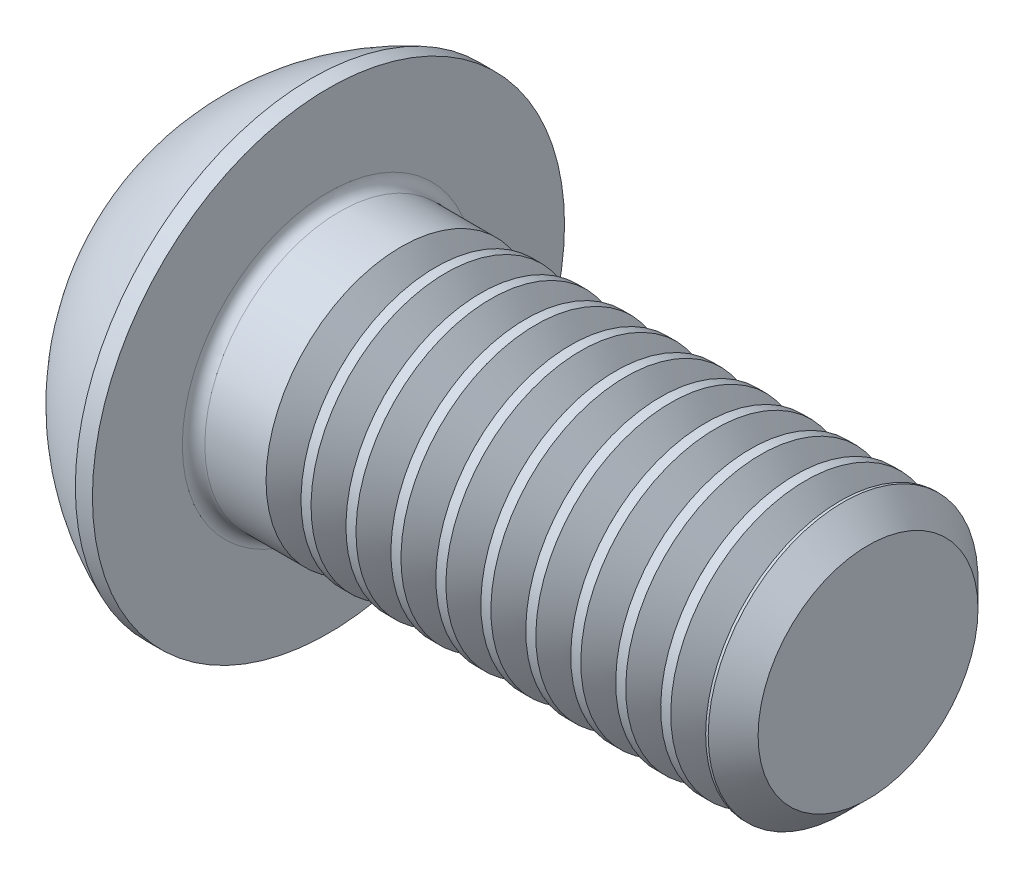
ISO-10303-21;
HEADER;
FILE_DESCRIPTION(('STEP AP214'),'2;1');
FILE_NAME('part.step','',(''),(''),'','','');
FILE_SCHEMA(('AUTOMOTIVE_DESIGN { 1 0 10303 214 1 1 1 1 }'));
ENDSEC;
DATA;
#1=APPLICATION_CONTEXT('core data for automotive mechanical design processes');
#2=APPLICATION_PROTOCOL_DEFINITION('international standard','automotive_design',2000,#1);
#3=PRODUCT_CONTEXT('',#1,'mechanical');
#4=PRODUCT('Part','Part','',(#3));
#5=PRODUCT_RELATED_PRODUCT_CATEGORY('part','',(#4));
#6=PRODUCT_DEFINITION_FORMATION('','',#4);
#7=PRODUCT_DEFINITION_CONTEXT('part definition',#1,'design');
#8=PRODUCT_DEFINITION('design','',#6,#7);
#9=PRODUCT_DEFINITION_SHAPE('','',#8);
#10=(LENGTH_UNIT() NAMED_UNIT(*) SI_UNIT(.MILLI.,.METRE.));
#11=(NAMED_UNIT(*) PLANE_ANGLE_UNIT() SI_UNIT($,.RADIAN.));
#12=(NAMED_UNIT(*) SI_UNIT($,.STERADIAN.) SOLID_ANGLE_UNIT());
#13=UNCERTAINTY_MEASURE_WITH_UNIT(LENGTH_MEASURE(1.E-05),#10,'distance_accuracy_value','');
#14=(GEOMETRIC_REPRESENTATION_CONTEXT(3) GLOBAL_UNCERTAINTY_ASSIGNED_CONTEXT((#13)) GLOBAL_UNIT_ASSIGNED_CONTEXT((#10,
#11,#12)) REPRESENTATION_CONTEXT('',''));
#15=CARTESIAN_POINT('',(0.,0.,0.));
#16=DIRECTION('',(0.,0.,1.));
#17=DIRECTION('',(1.,0.,0.));
#18=AXIS2_PLACEMENT_3D('',#15,#16,#17);
#19=CARTESIAN_POINT('',(0.,0.,0.));
#20=DIRECTION('',(-1.,0.,0.));
#21=DIRECTION('',(0.,0.,1.));
#22=AXIS2_PLACEMENT_3D('',#19,#20,#21);
#23=PLANE('',#22);
#24=CARTESIAN_POINT('',(0.,0.,0.));
#25=DIRECTION('',(-1.,0.,0.));
#26=DIRECTION('',(0.,0.,1.));
#27=AXIS2_PLACEMENT_3D('',#24,#25,#26);
#28=CIRCLE('',#27,2.625);
#29=CARTESIAN_POINT('',(0.,2.625,0.));
#30=VERTEX_POINT('',#29);
#31=EDGE_CURVE('E156',#30,#30,#28,.T.);
#32=ORIENTED_EDGE('',*,*,#31,.T.);
#33=EDGE_LOOP('',(#32));
#34=FACE_BOUND('',#33,.T.);
#35=DIRECTION('',(0.,-1.,0.));
#36=VECTOR('',#35,1.);
#37=CARTESIAN_POINT('',(0.,-1.15470053837925,2.));
#38=LINE('',#37,#36);
#39=CARTESIAN_POINT('',(0.,1.15470053837925,2.));
#40=VERTEX_POINT('',#39);
#41=CARTESIAN_POINT('',(0.,-1.15470053837925,2.));
#42=VERTEX_POINT('',#41);
#43=EDGE_CURVE('E51',#40,#42,#38,.T.);
#44=ORIENTED_EDGE('',*,*,#43,.T.);
#45=DIRECTION('',(0.,-0.499999999999998,-0.86602540378444));
#46=VECTOR('',#45,1.);
#47=CARTESIAN_POINT('',(0.,-2.3094010767585,0.));
#48=LINE('',#47,#46);
#49=CARTESIAN_POINT('',(0.,-2.3094010767585,0.));
#50=VERTEX_POINT('',#49);
#51=EDGE_CURVE('E409',#42,#50,#48,.T.);
#52=ORIENTED_EDGE('',*,*,#51,.T.);
#53=DIRECTION('',(0.,0.499999999999998,-0.86602540378444));
#54=VECTOR('',#53,1.);
#55=CARTESIAN_POINT('',(0.,-1.15470053837925,-2.));
#56=LINE('',#55,#54);
#57=CARTESIAN_POINT('',(0.,-1.15470053837925,-2.));
#58=VERTEX_POINT('',#57);
#59=EDGE_CURVE('E131',#50,#58,#56,.T.);
#60=ORIENTED_EDGE('',*,*,#59,.T.);
#61=DIRECTION('',(0.,1.,0.));
#62=VECTOR('',#61,1.);
#63=CARTESIAN_POINT('',(0.,1.15470053837925,-2.));
#64=LINE('',#63,#62);
#65=CARTESIAN_POINT('',(0.,1.15470053837925,-2.));
#66=VERTEX_POINT('',#65);
#67=EDGE_CURVE('E429',#58,#66,#64,.T.);
#68=ORIENTED_EDGE('',*,*,#67,.T.);
#69=DIRECTION('',(0.,0.499999999999999,0.866025403784439));
#70=VECTOR('',#69,1.);
#71=CARTESIAN_POINT('',(0.,2.3094010767585,0.));
#72=LINE('',#71,#70);
#73=CARTESIAN_POINT('',(0.,2.3094010767585,0.));
#74=VERTEX_POINT('',#73);
#75=EDGE_CURVE('E431',#66,#74,#72,.T.);
#76=ORIENTED_EDGE('',*,*,#75,.T.);
#77=DIRECTION('',(0.,-0.499999999999999,0.866025403784439));
#78=VECTOR('',#77,1.);
#79=CARTESIAN_POINT('',(0.,1.15470053837925,2.));
#80=LINE('',#79,#78);
#81=EDGE_CURVE('E433',#74,#40,#80,.T.);
#82=ORIENTED_EDGE('',*,*,#81,.T.);
#83=EDGE_LOOP('',(#44,#52,#60,#68,#76,#82));
#84=FACE_BOUND('',#83,.T.);
#85=ADVANCED_FACE('F36',(#34,#84),#23,.T.);
#86=CARTESIAN_POINT('',(4.99970462328768,0.,0.));
#87=DIRECTION('',(-1.,0.,0.));
#88=DIRECTION('',(0.,1.,0.));
#89=AXIS2_PLACEMENT_3D('',#86,#87,#88);
#90=SPHERICAL_SURFACE('',#89,5.64691697478582);
#91=CARTESIAN_POINT('',(2.92,0.,0.));
#92=DIRECTION('',(-1.,0.,0.));
#93=DIRECTION('',(0.,0.,1.));
#94=AXIS2_PLACEMENT_3D('',#91,#92,#93);
#95=CIRCLE('',#94,5.25);
#96=CARTESIAN_POINT('',(2.92,5.25,0.));
#97=VERTEX_POINT('',#96);
#98=EDGE_CURVE('E153',#97,#97,#95,.T.);
#99=CARTESIAN_POINT('',(2.92,5.25,0.));
#100=CARTESIAN_POINT('',(2.88116333139993,5.23461555496798,0.));
#101=CARTESIAN_POINT('',(2.84249743445724,5.21880002304115,0.));
#102=CARTESIAN_POINT('',(2.76552608609884,5.18631490596423,0.));
#103=CARTESIAN_POINT('',(2.72722063468312,5.16964532081416,0.));
#104=CARTESIAN_POINT('',(2.65098907959088,5.13546021785716,0.));
#105=CARTESIAN_POINT('',(2.61306297591435,5.11794470005024,0.));
#106=CARTESIAN_POINT('',(2.5376087841269,5.08207638165227,0.));
#107=CARTESIAN_POINT('',(2.50008069601598,5.06372358106121,0.));
#108=CARTESIAN_POINT('',(2.42544101991594,5.02618972911532,0.));
#109=CARTESIAN_POINT('',(2.38832943192683,5.00700867776048,0.));
#110=CARTESIAN_POINT('',(2.31454103209333,4.9678277722965,0.));
#111=CARTESIAN_POINT('',(2.27786422024896,4.94782791818736,0.));
#112=CARTESIAN_POINT('',(2.204963435524,4.90701925630077,0.));
#113=CARTESIAN_POINT('',(2.16873946264343,4.88621044852333,0.));
#114=CARTESIAN_POINT('',(2.09676219540546,4.84379412736126,0.));
#115=CARTESIAN_POINT('',(2.06100890104806,4.82218661397662,0.));
#116=CARTESIAN_POINT('',(1.9899905986814,4.77818352285276,0.));
#117=CARTESIAN_POINT('',(1.95472559067213,4.75578794511354,0.));
#118=CARTESIAN_POINT('',(1.88470122833741,4.71021975468139,0.));
#119=CARTESIAN_POINT('',(1.84994187401195,4.68704714198847,0.));
#120=CARTESIAN_POINT('',(1.78094593736053,4.63993629371345,0.));
#121=CARTESIAN_POINT('',(1.74670935503456,4.61599805813134,0.));
#122=CARTESIAN_POINT('',(1.67877582324134,4.56736775320002,0.));
#123=CARTESIAN_POINT('',(1.6450788737741,4.5426756838508,0.));
#124=CARTESIAN_POINT('',(1.57824120279908,4.4925498717552,0.));
#125=CARTESIAN_POINT('',(1.54510048129131,4.4671161290088,0.));
#126=CARTESIAN_POINT('',(1.4793915874043,4.4155194957489,0.));
#127=CARTESIAN_POINT('',(1.44682341502508,4.38935660523539,0.));
#128=CARTESIAN_POINT('',(1.3822756585948,4.33631456116252,0.));
#129=CARTESIAN_POINT('',(1.35029607454376,4.30943540760316,0.));
#130=CARTESIAN_POINT('',(1.28694124410103,4.2549740749057,0.));
#131=CARTESIAN_POINT('',(1.25556599770935,4.22739189576759,0.));
#132=CARTESIAN_POINT('',(1.19343529429185,4.17153809560631,0.));
#133=CARTESIAN_POINT('',(1.16267983726603,4.14326647458313,0.));
#134=CARTESIAN_POINT('',(1.10180385905236,4.0860477138823,0.));
#135=CARTESIAN_POINT('',(1.07168333786452,4.05710057420464,0.));
#136=CARTESIAN_POINT('',(1.01209206510523,3.99854503210538,0.));
#137=CARTESIAN_POINT('',(0.982621313533779,3.96893662968379,0.));
#138=CARTESIAN_POINT('',(0.924344093786626,3.90907314366641,0.));
#139=CARTESIAN_POINT('',(0.895537625610919,3.87881806007063,0.));
#140=CARTESIAN_POINT('',(0.838603159287822,3.8176761117527,0.));
#141=CARTESIAN_POINT('',(0.810475161140432,3.78678924703054,0.));
#142=CARTESIAN_POINT('',(0.754911487372878,3.72439894764781,0.));
#143=CARTESIAN_POINT('',(0.727475811752715,3.69289551298725,0.));
#144=CARTESIAN_POINT('',(0.673310294583733,3.62928758856413,0.));
#145=CARTESIAN_POINT('',(0.646580453034914,3.59718309880158,0.));
#146=CARTESIAN_POINT('',(0.593839767940169,3.53238887502059,0.));
#147=CARTESIAN_POINT('',(0.567828924394242,3.49969914100215,0.));
#148=CARTESIAN_POINT('',(0.516539045154726,3.43375052777114,0.));
#149=CARTESIAN_POINT('',(0.491260009461136,3.40049164855857,0.));
#150=CARTESIAN_POINT('',(0.441446195334815,3.33342112431611,0.));
#151=CARTESIAN_POINT('',(0.416911416902085,3.29960947928621,0.));
#152=CARTESIAN_POINT('',(0.368598200321405,3.23145007493057,0.));
#153=CARTESIAN_POINT('',(0.344819762173456,3.19710231560483,0.));
#154=CARTESIAN_POINT('',(0.298030936151543,3.12788759851044,0.));
#155=CARTESIAN_POINT('',(0.275020548277578,3.09302064074179,0.));
#156=CARTESIAN_POINT('',(0.229779156601617,3.02278469716988,0.));
#157=CARTESIAN_POINT('',(0.207548152799621,2.98741571136661,0.));
#158=CARTESIAN_POINT('',(0.163876471550351,2.91619313362712,0.));
#159=CARTESIAN_POINT('',(0.142435794103077,2.8803395416909,0.));
#160=CARTESIAN_POINT('',(0.100355347300805,2.80816539636944,0.));
#161=CARTESIAN_POINT('',(0.0797155779458076,2.7718448429842,0.));
#162=CARTESIAN_POINT('',(0.0392470276158926,2.69875470867178,0.));
#163=CARTESIAN_POINT('',(0.0194182466409753,2.66198512774461,0.));
#164=CARTESIAN_POINT('',(0.,2.625,0.));
#165=B_SPLINE_CURVE_WITH_KNOTS('',3,(#99,#100,#101,#102,#103,#104,#105,#106,#107,#108,#109,#110,
#111,#112,#113,#114,#115,#116,#117,#118,#119,#120,#121,#122,#123,#124,#125,#126,#127,#128,#129,
#130,#131,#132,#133,#134,#135,#136,#137,#138,#139,#140,#141,#142,#143,#144,#145,#146,#147,#148,
#149,#150,#151,#152,#153,#154,#155,#156,#157,#158,#159,#160,#161,#162,#163,#164),.UNSPECIFIED.,
.F.,.F.,(4,2,2,2,2,2,2,2,2,2,2,2,2,2,2,2,2,2,2,2,2,2,2,2,2,2,2,2,2,2,2,2,4),(0.,
0.12531586463099,0.25063172926198,0.37594759389297,0.501263458523959,0.626579323154949,
0.751895187785939,0.877211052416928,1.00252691704792,1.12784278167891,1.2531586463099,
1.37847451094089,1.50379037557188,1.62910624020287,1.75442210483386,1.87973796946485,
2.00505383409584,2.13036969872683,2.25568556335782,2.38100142798881,2.5063172926198,
2.63163315725079,2.75694902188178,2.88226488651277,3.00758075114376,3.13289661577475,
3.25821248040574,3.38352834503673,3.50884420966772,3.6341600742987,3.7594759389297,
3.88479180356069,4.01010766819167),.UNSPECIFIED.);
#166=EDGE_CURVE('BSEAM178',#97,#30,#165,.T.);
#167=ORIENTED_EDGE('',*,*,#98,.T.);
#168=ORIENTED_EDGE('',*,*,#31,.F.);
#169=ORIENTED_EDGE('',*,*,#166,.T.);
#170=ORIENTED_EDGE('',*,*,#166,.F.);
#171=EDGE_LOOP('',(#167,#169,#168,#170));
#172=FACE_BOUND('',#171,.T.);
#173=ADVANCED_FACE('F178',(#172),#90,.T.);
#174=CARTESIAN_POINT('',(0.,0.,0.));
#175=DIRECTION('',(-1.,0.,0.));
#176=DIRECTION('',(0.,0.,1.));
#177=AXIS2_PLACEMENT_3D('',#174,#175,#176);
#178=CYLINDRICAL_SURFACE('',#177,5.25);
#179=ORIENTED_EDGE('',*,*,#98,.F.);
#180=EDGE_LOOP('',(#179));
#181=FACE_BOUND('',#180,.T.);
#182=CARTESIAN_POINT('',(3.3,0.,0.));
#183=DIRECTION('',(-1.,0.,0.));
#184=DIRECTION('',(0.,0.,1.));
#185=AXIS2_PLACEMENT_3D('',#182,#183,#184);
#186=CIRCLE('',#185,5.25);
#187=CARTESIAN_POINT('',(3.3,0.,5.25));
#188=VERTEX_POINT('',#187);
#189=EDGE_CURVE('E150',#188,#188,#186,.T.);
#190=ORIENTED_EDGE('',*,*,#189,.T.);
#191=EDGE_LOOP('',(#190));
#192=FACE_BOUND('',#191,.T.);
#193=ADVANCED_FACE('F183',(#181,#192),#178,.T.);
#194=CARTESIAN_POINT('',(3.3,2.99999999999999,0.));
#195=DIRECTION('',(-1.,0.,0.));
#196=DIRECTION('',(0.,0.,1.));
#197=AXIS2_PLACEMENT_3D('',#194,#195,#196);
#198=PLANE('',#197);
#199=CARTESIAN_POINT('',(3.3,0.,0.));
#200=DIRECTION('',(-1.,0.,0.));
#201=DIRECTION('',(0.,0.,1.));
#202=AXIS2_PLACEMENT_3D('',#199,#200,#201);
#203=CIRCLE('',#202,3.24999999999999);
#204=CARTESIAN_POINT('',(3.3,0.,3.24999999999999));
#205=VERTEX_POINT('',#204);
#206=EDGE_CURVE('E44',#205,#205,#203,.T.);
#207=ORIENTED_EDGE('',*,*,#206,.T.);
#208=EDGE_LOOP('',(#207));
#209=FACE_BOUND('',#208,.T.);
#210=ORIENTED_EDGE('',*,*,#189,.F.);
#211=EDGE_LOOP('',(#210));
#212=FACE_BOUND('',#211,.T.);
#213=ADVANCED_FACE('F161',(#209,#212),#198,.F.);
#214=CARTESIAN_POINT('',(0.,0.,0.));
#215=DIRECTION('',(-1.,0.,0.));
#216=DIRECTION('',(0.,0.,1.));
#217=AXIS2_PLACEMENT_3D('',#214,#215,#216);
#218=CYLINDRICAL_SURFACE('',#217,2.99999999999999);
#219=CARTESIAN_POINT('',(4.91173492006271,0.,0.));
#220=DIRECTION('',(-1.,0.,0.));
#221=DIRECTION('',(0.,-1.,0.));
#222=AXIS2_PLACEMENT_3D('',#219,#220,#221);
#223=CIRCLE('',#222,3.);
#224=CARTESIAN_POINT('',(4.91173492006271,-3.,0.));
#225=VERTEX_POINT('',#224);
#226=EDGE_CURVE('E404',#225,#225,#223,.T.);
#227=ORIENTED_EDGE('',*,*,#226,.T.);
#228=EDGE_LOOP('',(#227));
#229=FACE_BOUND('',#228,.T.);
#230=CARTESIAN_POINT('',(3.55,0.,0.));
#231=DIRECTION('',(-1.,0.,0.));
#232=DIRECTION('',(0.,0.,1.));
#233=AXIS2_PLACEMENT_3D('',#230,#231,#232);
#234=CIRCLE('',#233,2.99999999999999);
#235=CARTESIAN_POINT('',(3.55,0.,2.99999999999999));
#236=VERTEX_POINT('',#235);
#237=EDGE_CURVE('E11',#236,#236,#234,.F.);
#238=ORIENTED_EDGE('',*,*,#237,.T.);
#239=EDGE_LOOP('',(#238));
#240=FACE_BOUND('',#239,.T.);
#241=ADVANCED_FACE('F165',(#229,#240),#218,.T.);
#242=CARTESIAN_POINT('',(3.55,0.,0.));
#243=DIRECTION('',(-1.,0.,0.));
#244=DIRECTION('',(0.,0.,1.));
#245=AXIS2_PLACEMENT_3D('',#242,#243,#244);
#246=TOROIDAL_SURFACE('',#245,3.24999999999999,0.25);
#247=ORIENTED_EDGE('',*,*,#237,.F.);
#248=EDGE_LOOP('',(#247));
#249=FACE_BOUND('',#248,.T.);
#250=ORIENTED_EDGE('',*,*,#206,.F.);
#251=EDGE_LOOP('',(#250));
#252=FACE_BOUND('',#251,.T.);
#253=ADVANCED_FACE('F38',(#249,#252),#246,.F.);
#254=CARTESIAN_POINT('',(2.08,-2.3094010767585,0.));
#255=DIRECTION('',(0.,0.86602540378444,-0.499999999999998));
#256=DIRECTION('',(0.,0.499999999999998,0.86602540378444));
#257=AXIS2_PLACEMENT_3D('',#254,#255,#256);
#258=PLANE('',#257);
#259=DIRECTION('',(0.,-0.499999999999998,-0.86602540378444));
#260=VECTOR('',#259,1.);
#261=CARTESIAN_POINT('',(2.08,-2.3094010767585,0.));
#262=LINE('',#261,#260);
#263=CARTESIAN_POINT('',(2.08,-1.15470053837925,2.));
#264=VERTEX_POINT('',#263);
#265=CARTESIAN_POINT('',(2.08,-1.73205080756888,0.999999999999994));
#266=VERTEX_POINT('',#265);
#267=EDGE_CURVE('E117',#264,#266,#262,.T.);
#268=ORIENTED_EDGE('',*,*,#267,.T.);
#269=CARTESIAN_POINT('',(2.08,-2.3094010767585,0.));
#270=VERTEX_POINT('',#269);
#271=EDGE_CURVE('E112',#266,#270,#262,.T.);
#272=ORIENTED_EDGE('',*,*,#271,.T.);
#273=DIRECTION('',(-1.,0.,0.));
#274=VECTOR('',#273,1.);
#275=CARTESIAN_POINT('',(2.08,-2.3094010767585,0.));
#276=LINE('',#275,#274);
#277=EDGE_CURVE('E114',#270,#50,#276,.T.);
#278=ORIENTED_EDGE('',*,*,#277,.T.);
#279=ORIENTED_EDGE('',*,*,#51,.F.);
#280=DIRECTION('',(-1.,0.,0.));
#281=VECTOR('',#280,1.);
#282=CARTESIAN_POINT('',(2.08,-1.15470053837925,2.));
#283=LINE('',#282,#281);
#284=EDGE_CURVE('E426',#264,#42,#283,.T.);
#285=ORIENTED_EDGE('',*,*,#284,.F.);
#286=EDGE_LOOP('',(#268,#272,#278,#279,#285));
#287=FACE_BOUND('',#286,.T.);
#288=ADVANCED_FACE('F113',(#287),#258,.T.);
#289=CARTESIAN_POINT('',(2.08,-1.15470053837925,-2.));
#290=DIRECTION('',(0.,0.86602540378444,0.499999999999998));
#291=DIRECTION('',(0.,-0.499999999999998,0.86602540378444));
#292=AXIS2_PLACEMENT_3D('',#289,#290,#291);
#293=PLANE('',#292);
#294=DIRECTION('',(0.,0.499999999999998,-0.86602540378444));
#295=VECTOR('',#294,1.);
#296=CARTESIAN_POINT('',(2.08,-1.15470053837925,-2.));
#297=LINE('',#296,#295);
#298=CARTESIAN_POINT('',(2.08,-1.73205080756888,-0.999999999999996));
#299=VERTEX_POINT('',#298);
#300=EDGE_CURVE('E59',#270,#299,#297,.T.);
#301=ORIENTED_EDGE('',*,*,#300,.T.);
#302=CARTESIAN_POINT('',(2.08,-1.15470053837925,-2.));
#303=VERTEX_POINT('',#302);
#304=EDGE_CURVE('E126',#299,#303,#297,.T.);
#305=ORIENTED_EDGE('',*,*,#304,.T.);
#306=DIRECTION('',(-1.,0.,0.));
#307=VECTOR('',#306,1.);
#308=CARTESIAN_POINT('',(2.08,-1.15470053837925,-2.));
#309=LINE('',#308,#307);
#310=EDGE_CURVE('E133',#303,#58,#309,.T.);
#311=ORIENTED_EDGE('',*,*,#310,.T.);
#312=ORIENTED_EDGE('',*,*,#59,.F.);
#313=ORIENTED_EDGE('',*,*,#277,.F.);
#314=EDGE_LOOP('',(#301,#305,#311,#312,#313));
#315=FACE_BOUND('',#314,.T.);
#316=ADVANCED_FACE('F129',(#315),#293,.T.);
#317=CARTESIAN_POINT('',(2.08,1.15470053837925,-2.));
#318=DIRECTION('',(0.,0.,1.));
#319=DIRECTION('',(0.,-1.,0.));
#320=AXIS2_PLACEMENT_3D('',#317,#318,#319);
#321=PLANE('',#320);
#322=DIRECTION('',(0.,1.,0.));
#323=VECTOR('',#322,1.);
#324=CARTESIAN_POINT('',(2.08,1.15470053837925,-2.));
#325=LINE('',#324,#323);
#326=CARTESIAN_POINT('',(2.08,0.,-2.));
#327=VERTEX_POINT('',#326);
#328=EDGE_CURVE('E411',#303,#327,#325,.T.);
#329=ORIENTED_EDGE('',*,*,#328,.T.);
#330=CARTESIAN_POINT('',(2.08,1.15470053837925,-2.));
#331=VERTEX_POINT('',#330);
#332=EDGE_CURVE('E125',#327,#331,#325,.T.);
#333=ORIENTED_EDGE('',*,*,#332,.T.);
#334=DIRECTION('',(-1.,0.,0.));
#335=VECTOR('',#334,1.);
#336=CARTESIAN_POINT('',(2.08,1.15470053837925,-2.));
#337=LINE('',#336,#335);
#338=EDGE_CURVE('E138',#331,#66,#337,.T.);
#339=ORIENTED_EDGE('',*,*,#338,.T.);
#340=ORIENTED_EDGE('',*,*,#67,.F.);
#341=ORIENTED_EDGE('',*,*,#310,.F.);
#342=EDGE_LOOP('',(#329,#333,#339,#340,#341));
#343=FACE_BOUND('',#342,.T.);
#344=ADVANCED_FACE('F209',(#343),#321,.T.);
#345=CARTESIAN_POINT('',(2.08,2.3094010767585,0.));
#346=DIRECTION('',(0.,-0.866025403784439,0.499999999999999));
#347=DIRECTION('',(0.,-0.499999999999999,-0.866025403784439));
#348=AXIS2_PLACEMENT_3D('',#345,#346,#347);
#349=PLANE('',#348);
#350=DIRECTION('',(0.,0.499999999999999,0.866025403784439));
#351=VECTOR('',#350,1.);
#352=CARTESIAN_POINT('',(2.08,2.3094010767585,0.));
#353=LINE('',#352,#351);
#354=CARTESIAN_POINT('',(2.08,1.73205080756888,-0.999999999999999));
#355=VERTEX_POINT('',#354);
#356=EDGE_CURVE('E415',#331,#355,#353,.T.);
#357=ORIENTED_EDGE('',*,*,#356,.T.);
#358=CARTESIAN_POINT('',(2.08,2.3094010767585,0.));
#359=VERTEX_POINT('',#358);
#360=EDGE_CURVE('E414',#355,#359,#353,.T.);
#361=ORIENTED_EDGE('',*,*,#360,.T.);
#362=DIRECTION('',(-1.,0.,0.));
#363=VECTOR('',#362,1.);
#364=CARTESIAN_POINT('',(2.08,2.3094010767585,0.));
#365=LINE('',#364,#363);
#366=EDGE_CURVE('E441',#359,#74,#365,.T.);
#367=ORIENTED_EDGE('',*,*,#366,.T.);
#368=ORIENTED_EDGE('',*,*,#75,.F.);
#369=ORIENTED_EDGE('',*,*,#338,.F.);
#370=EDGE_LOOP('',(#357,#361,#367,#368,#369));
#371=FACE_BOUND('',#370,.T.);
#372=ADVANCED_FACE('F212',(#371),#349,.T.);
#373=CARTESIAN_POINT('',(2.08,1.15470053837925,2.));
#374=DIRECTION('',(0.,-0.866025403784439,-0.499999999999999));
#375=DIRECTION('',(0.,0.499999999999999,-0.866025403784439));
#376=AXIS2_PLACEMENT_3D('',#373,#374,#375);
#377=PLANE('',#376);
#378=DIRECTION('',(0.,-0.499999999999999,0.866025403784439));
#379=VECTOR('',#378,1.);
#380=CARTESIAN_POINT('',(2.08,1.15470053837925,2.));
#381=LINE('',#380,#379);
#382=CARTESIAN_POINT('',(2.08,1.73205080756888,0.999999999999999));
#383=VERTEX_POINT('',#382);
#384=EDGE_CURVE('E419',#359,#383,#381,.T.);
#385=ORIENTED_EDGE('',*,*,#384,.T.);
#386=CARTESIAN_POINT('',(2.08,1.15470053837925,2.));
#387=VERTEX_POINT('',#386);
#388=EDGE_CURVE('E418',#383,#387,#381,.T.);
#389=ORIENTED_EDGE('',*,*,#388,.T.);
#390=DIRECTION('',(-1.,0.,0.));
#391=VECTOR('',#390,1.);
#392=CARTESIAN_POINT('',(2.08,1.15470053837925,2.));
#393=LINE('',#392,#391);
#394=EDGE_CURVE('E438',#387,#40,#393,.T.);
#395=ORIENTED_EDGE('',*,*,#394,.T.);
#396=ORIENTED_EDGE('',*,*,#81,.F.);
#397=ORIENTED_EDGE('',*,*,#366,.F.);
#398=EDGE_LOOP('',(#385,#389,#395,#396,#397));
#399=FACE_BOUND('',#398,.T.);
#400=ADVANCED_FACE('F216',(#399),#377,.T.);
#401=CARTESIAN_POINT('',(2.08,-1.15470053837925,2.));
#402=DIRECTION('',(0.,0.,-1.));
#403=DIRECTION('',(0.,1.,0.));
#404=AXIS2_PLACEMENT_3D('',#401,#402,#403);
#405=PLANE('',#404);
#406=DIRECTION('',(0.,-1.,0.));
#407=VECTOR('',#406,1.);
#408=CARTESIAN_POINT('',(2.08,-1.15470053837925,2.));
#409=LINE('',#408,#407);
#410=CARTESIAN_POINT('',(2.08,0.,2.));
#411=VERTEX_POINT('',#410);
#412=EDGE_CURVE('E423',#387,#411,#409,.T.);
#413=ORIENTED_EDGE('',*,*,#412,.T.);
#414=EDGE_CURVE('E422',#411,#264,#409,.T.);
#415=ORIENTED_EDGE('',*,*,#414,.T.);
#416=ORIENTED_EDGE('',*,*,#284,.T.);
#417=ORIENTED_EDGE('',*,*,#43,.F.);
#418=ORIENTED_EDGE('',*,*,#394,.F.);
#419=EDGE_LOOP('',(#413,#415,#416,#417,#418));
#420=FACE_BOUND('',#419,.T.);
#421=ADVANCED_FACE('F220',(#420),#405,.T.);
#422=CARTESIAN_POINT('',(2.08,-3.46410161513774,-2.));
#423=DIRECTION('',(1.,0.,0.));
#424=DIRECTION('',(0.,0.,-1.));
#425=AXIS2_PLACEMENT_3D('',#422,#423,#424);
#426=PLANE('',#425);
#427=CARTESIAN_POINT('',(2.08,0.,0.));
#428=DIRECTION('',(-1.,0.,0.));
#429=DIRECTION('',(0.,0.,1.));
#430=AXIS2_PLACEMENT_3D('',#427,#428,#429);
#431=CIRCLE('',#430,2.);
#432=EDGE_CURVE('E455',#355,#327,#431,.T.);
#433=ORIENTED_EDGE('',*,*,#432,.F.);
#434=ORIENTED_EDGE('',*,*,#356,.F.);
#435=ORIENTED_EDGE('',*,*,#332,.F.);
#436=EDGE_LOOP('',(#433,#434,#435));
#437=FACE_BOUND('',#436,.T.);
#438=ADVANCED_FACE('F224',(#437),#426,.F.);
#439=EDGE_CURVE('E144',#383,#355,#431,.T.);
#440=ORIENTED_EDGE('',*,*,#439,.F.);
#441=ORIENTED_EDGE('',*,*,#384,.F.);
#442=ORIENTED_EDGE('',*,*,#360,.F.);
#443=EDGE_LOOP('',(#440,#441,#442));
#444=FACE_BOUND('',#443,.T.);
#445=ADVANCED_FACE('F463',(#444),#426,.F.);
#446=EDGE_CURVE('E137',#411,#383,#431,.T.);
#447=ORIENTED_EDGE('',*,*,#446,.F.);
#448=ORIENTED_EDGE('',*,*,#412,.F.);
#449=ORIENTED_EDGE('',*,*,#388,.F.);
#450=EDGE_LOOP('',(#447,#448,#449));
#451=FACE_BOUND('',#450,.T.);
#452=ADVANCED_FACE('F466',(#451),#426,.F.);
#453=EDGE_CURVE('E132',#266,#411,#431,.T.);
#454=ORIENTED_EDGE('',*,*,#453,.F.);
#455=ORIENTED_EDGE('',*,*,#267,.F.);
#456=ORIENTED_EDGE('',*,*,#414,.F.);
#457=EDGE_LOOP('',(#454,#455,#456));
#458=FACE_BOUND('',#457,.T.);
#459=ADVANCED_FACE('F470',(#458),#426,.F.);
#460=EDGE_CURVE('E123',#299,#266,#431,.T.);
#461=ORIENTED_EDGE('',*,*,#460,.F.);
#462=ORIENTED_EDGE('',*,*,#300,.F.);
#463=ORIENTED_EDGE('',*,*,#271,.F.);
#464=EDGE_LOOP('',(#461,#462,#463));
#465=FACE_BOUND('',#464,.T.);
#466=ADVANCED_FACE('F122',(#465),#426,.F.);
#467=EDGE_CURVE('E454',#327,#299,#431,.T.);
#468=ORIENTED_EDGE('',*,*,#467,.F.);
#469=ORIENTED_EDGE('',*,*,#328,.F.);
#470=ORIENTED_EDGE('',*,*,#304,.F.);
#471=EDGE_LOOP('',(#468,#469,#470));
#472=FACE_BOUND('',#471,.T.);
#473=ADVANCED_FACE('F204',(#472),#426,.F.);
#474=CARTESIAN_POINT('',(3.23470053837927,0.,0.));
#475=DIRECTION('',(-1.,0.,0.));
#476=DIRECTION('',(0.,0.,1.));
#477=AXIS2_PLACEMENT_3D('',#474,#475,#476);
#478=CONICAL_SURFACE('',#477,0.,1.04719755119659);
#479=ORIENTED_EDGE('',*,*,#446,.T.);
#480=ORIENTED_EDGE('',*,*,#439,.T.);
#481=ORIENTED_EDGE('',*,*,#432,.T.);
#482=ORIENTED_EDGE('',*,*,#467,.T.);
#483=ORIENTED_EDGE('',*,*,#460,.T.);
#484=ORIENTED_EDGE('',*,*,#453,.T.);
#485=EDGE_LOOP('',(#479,#480,#481,#482,#483,#484));
#486=FACE_BOUND('',#485,.T.);
#487=CARTESIAN_POINT('',(3.23470053837927,0.,0.));
#488=VERTEX_POINT('',#487);
#489=VERTEX_LOOP('',#488);
#490=FACE_BOUND('',#489,.T.);
#491=ADVANCED_FACE('F201',(#486,#490),#478,.F.);
#492=CARTESIAN_POINT('',(5.68826507993728,0.,0.));
#493=DIRECTION('',(1.,0.,0.));
#494=DIRECTION('',(0.,1.,0.));
#495=AXIS2_PLACEMENT_3D('',#492,#493,#494);
#496=CONICAL_SURFACE('',#495,3.,0.959931088596882);
#497=CARTESIAN_POINT('',(5.3,0.,0.));
#498=DIRECTION('',(-1.,0.,0.));
#499=DIRECTION('',(0.,-1.,0.));
#500=AXIS2_PLACEMENT_3D('',#497,#498,#499);
#501=CIRCLE('',#500,2.4455);
#502=CARTESIAN_POINT('',(5.3,-2.4455,0.));
#503=VERTEX_POINT('',#502);
#504=EDGE_CURVE('E401',#503,#503,#501,.T.);
#505=ORIENTED_EDGE('',*,*,#504,.F.);
#506=EDGE_LOOP('',(#505));
#507=FACE_BOUND('',#506,.T.);
#508=CARTESIAN_POINT('',(5.68826507993728,0.,0.));
#509=DIRECTION('',(-1.,0.,0.));
#510=DIRECTION('',(0.,-1.,0.));
#511=AXIS2_PLACEMENT_3D('',#508,#509,#510);
#512=CIRCLE('',#511,3.);
#513=CARTESIAN_POINT('',(5.68826507993728,-3.,0.));
#514=VERTEX_POINT('',#513);
#515=EDGE_CURVE('E407',#514,#514,#512,.T.);
#516=ORIENTED_EDGE('',*,*,#515,.T.);
#517=EDGE_LOOP('',(#516));
#518=FACE_BOUND('',#517,.T.);
#519=ADVANCED_FACE('F203',(#507,#518),#496,.T.);
#520=CARTESIAN_POINT('',(5.3,0.,0.));
#521=DIRECTION('',(-1.,0.,0.));
#522=DIRECTION('',(0.,-1.,0.));
#523=AXIS2_PLACEMENT_3D('',#520,#521,#522);
#524=CONICAL_SURFACE('',#523,2.4455,0.959931088596877);
#525=ORIENTED_EDGE('',*,*,#226,.F.);
#526=EDGE_LOOP('',(#525));
#527=FACE_BOUND('',#526,.T.);
#528=ORIENTED_EDGE('',*,*,#504,.T.);
#529=EDGE_LOOP('',(#528));
#530=FACE_BOUND('',#529,.T.);
#531=ADVANCED_FACE('F231',(#527,#530),#524,.T.);
#532=CARTESIAN_POINT('',(5.91173492006271,0.,0.));
#533=DIRECTION('',(-1.,0.,0.));
#534=DIRECTION('',(0.,-1.,0.));
#535=AXIS2_PLACEMENT_3D('',#532,#533,#534);
#536=CIRCLE('',#535,3.);
#537=CARTESIAN_POINT('',(5.91173492006271,-3.,0.));
#538=VERTEX_POINT('',#537);
#539=EDGE_CURVE('E395',#538,#538,#536,.T.);
#540=ORIENTED_EDGE('',*,*,#539,.T.);
#541=EDGE_LOOP('',(#540));
#542=FACE_BOUND('',#541,.T.);
#543=ORIENTED_EDGE('',*,*,#515,.F.);
#544=EDGE_LOOP('',(#543));
#545=FACE_BOUND('',#544,.T.);
#546=ADVANCED_FACE('F175',(#542,#545),#218,.T.);
#547=CARTESIAN_POINT('',(6.68826507993728,0.,0.));
#548=DIRECTION('',(1.,0.,0.));
#549=DIRECTION('',(0.,1.,0.));
#550=AXIS2_PLACEMENT_3D('',#547,#548,#549);
#551=CONICAL_SURFACE('',#550,3.,0.959931088596882);
#552=CARTESIAN_POINT('',(6.3,0.,0.));
#553=DIRECTION('',(-1.,0.,0.));
#554=DIRECTION('',(0.,-1.,0.));
#555=AXIS2_PLACEMENT_3D('',#552,#553,#554);
#556=CIRCLE('',#555,2.4455);
#557=CARTESIAN_POINT('',(6.3,-2.4455,0.));
#558=VERTEX_POINT('',#557);
#559=EDGE_CURVE('E392',#558,#558,#556,.T.);
#560=ORIENTED_EDGE('',*,*,#559,.F.);
#561=EDGE_LOOP('',(#560));
#562=FACE_BOUND('',#561,.T.);
#563=CARTESIAN_POINT('',(6.68826507993728,0.,0.));
#564=DIRECTION('',(-1.,0.,0.));
#565=DIRECTION('',(0.,-1.,0.));
#566=AXIS2_PLACEMENT_3D('',#563,#564,#565);
#567=CIRCLE('',#566,3.);
#568=CARTESIAN_POINT('',(6.68826507993728,-3.,0.));
#569=VERTEX_POINT('',#568);
#570=EDGE_CURVE('E398',#569,#569,#567,.T.);
#571=ORIENTED_EDGE('',*,*,#570,.T.);
#572=EDGE_LOOP('',(#571));
#573=FACE_BOUND('',#572,.T.);
#574=ADVANCED_FACE('F236',(#562,#573),#551,.T.);
#575=CARTESIAN_POINT('',(6.3,0.,0.));
#576=DIRECTION('',(-1.,0.,0.));
#577=DIRECTION('',(0.,-1.,0.));
#578=AXIS2_PLACEMENT_3D('',#575,#576,#577);
#579=CONICAL_SURFACE('',#578,2.4455,0.959931088596877);
#580=ORIENTED_EDGE('',*,*,#539,.F.);
#581=EDGE_LOOP('',(#580));
#582=FACE_BOUND('',#581,.T.);
#583=ORIENTED_EDGE('',*,*,#559,.T.);
#584=EDGE_LOOP('',(#583));
#585=FACE_BOUND('',#584,.T.);
#586=ADVANCED_FACE('F239',(#582,#585),#579,.T.);
#587=CARTESIAN_POINT('',(6.91173492006271,0.,0.));
#588=DIRECTION('',(-1.,0.,0.));
#589=DIRECTION('',(0.,-1.,0.));
#590=AXIS2_PLACEMENT_3D('',#587,#588,#589);
#591=CIRCLE('',#590,3.);
#592=CARTESIAN_POINT('',(6.91173492006271,-3.,0.));
#593=VERTEX_POINT('',#592);
#594=EDGE_CURVE('E386',#593,#593,#591,.T.);
#595=ORIENTED_EDGE('',*,*,#594,.T.);
#596=EDGE_LOOP('',(#595));
#597=FACE_BOUND('',#596,.T.);
#598=ORIENTED_EDGE('',*,*,#570,.F.);
#599=EDGE_LOOP('',(#598));
#600=FACE_BOUND('',#599,.T.);
#601=ADVANCED_FACE('F243',(#597,#600),#218,.T.);
#602=CARTESIAN_POINT('',(7.68826507993728,0.,0.));
#603=DIRECTION('',(1.,0.,0.));
#604=DIRECTION('',(0.,1.,0.));
#605=AXIS2_PLACEMENT_3D('',#602,#603,#604);
#606=CONICAL_SURFACE('',#605,3.,0.959931088596882);
#607=CARTESIAN_POINT('',(7.3,0.,0.));
#608=DIRECTION('',(-1.,0.,0.));
#609=DIRECTION('',(0.,-1.,0.));
#610=AXIS2_PLACEMENT_3D('',#607,#608,#609);
#611=CIRCLE('',#610,2.4455);
#612=CARTESIAN_POINT('',(7.3,-2.4455,0.));
#613=VERTEX_POINT('',#612);
#614=EDGE_CURVE('E383',#613,#613,#611,.T.);
#615=ORIENTED_EDGE('',*,*,#614,.F.);
#616=EDGE_LOOP('',(#615));
#617=FACE_BOUND('',#616,.T.);
#618=CARTESIAN_POINT('',(7.68826507993728,0.,0.));
#619=DIRECTION('',(-1.,0.,0.));
#620=DIRECTION('',(0.,-1.,0.));
#621=AXIS2_PLACEMENT_3D('',#618,#619,#620);
#622=CIRCLE('',#621,3.);
#623=CARTESIAN_POINT('',(7.68826507993728,-3.,0.));
#624=VERTEX_POINT('',#623);
#625=EDGE_CURVE('E389',#624,#624,#622,.T.);
#626=ORIENTED_EDGE('',*,*,#625,.T.);
#627=EDGE_LOOP('',(#626));
#628=FACE_BOUND('',#627,.T.);
#629=ADVANCED_FACE('F245',(#617,#628),#606,.T.);
#630=CARTESIAN_POINT('',(7.3,0.,0.));
#631=DIRECTION('',(-1.,0.,0.));
#632=DIRECTION('',(0.,-1.,0.));
#633=AXIS2_PLACEMENT_3D('',#630,#631,#632);
#634=CONICAL_SURFACE('',#633,2.4455,0.959931088596877);
#635=ORIENTED_EDGE('',*,*,#594,.F.);
#636=EDGE_LOOP('',(#635));
#637=FACE_BOUND('',#636,.T.);
#638=ORIENTED_EDGE('',*,*,#614,.T.);
#639=EDGE_LOOP('',(#638));
#640=FACE_BOUND('',#639,.T.);
#641=ADVANCED_FACE('F248',(#637,#640),#634,.T.);
#642=CARTESIAN_POINT('',(7.91173492006271,0.,0.));
#643=DIRECTION('',(-1.,0.,0.));
#644=DIRECTION('',(0.,-1.,0.));
#645=AXIS2_PLACEMENT_3D('',#642,#643,#644);
#646=CIRCLE('',#645,3.);
#647=CARTESIAN_POINT('',(7.91173492006271,-3.,0.));
#648=VERTEX_POINT('',#647);
#649=EDGE_CURVE('E377',#648,#648,#646,.T.);
#650=ORIENTED_EDGE('',*,*,#649,.T.);
#651=EDGE_LOOP('',(#650));
#652=FACE_BOUND('',#651,.T.);
#653=ORIENTED_EDGE('',*,*,#625,.F.);
#654=EDGE_LOOP('',(#653));
#655=FACE_BOUND('',#654,.T.);
#656=ADVANCED_FACE('F252',(#652,#655),#218,.T.);
#657=CARTESIAN_POINT('',(8.68826507993728,0.,0.));
#658=DIRECTION('',(1.,0.,0.));
#659=DIRECTION('',(0.,1.,0.));
#660=AXIS2_PLACEMENT_3D('',#657,#658,#659);
#661=CONICAL_SURFACE('',#660,3.,0.959931088596882);
#662=CARTESIAN_POINT('',(8.3,0.,0.));
#663=DIRECTION('',(-1.,0.,0.));
#664=DIRECTION('',(0.,-1.,0.));
#665=AXIS2_PLACEMENT_3D('',#662,#663,#664);
#666=CIRCLE('',#665,2.4455);
#667=CARTESIAN_POINT('',(8.3,-2.4455,0.));
#668=VERTEX_POINT('',#667);
#669=EDGE_CURVE('E374',#668,#668,#666,.T.);
#670=ORIENTED_EDGE('',*,*,#669,.F.);
#671=EDGE_LOOP('',(#670));
#672=FACE_BOUND('',#671,.T.);
#673=CARTESIAN_POINT('',(8.68826507993728,0.,0.));
#674=DIRECTION('',(-1.,0.,0.));
#675=DIRECTION('',(0.,-1.,0.));
#676=AXIS2_PLACEMENT_3D('',#673,#674,#675);
#677=CIRCLE('',#676,3.);
#678=CARTESIAN_POINT('',(8.68826507993728,-3.,0.));
#679=VERTEX_POINT('',#678);
#680=EDGE_CURVE('E380',#679,#679,#677,.T.);
#681=ORIENTED_EDGE('',*,*,#680,.T.);
#682=EDGE_LOOP('',(#681));
#683=FACE_BOUND('',#682,.T.);
#684=ADVANCED_FACE('F254',(#672,#683),#661,.T.);
#685=CARTESIAN_POINT('',(8.3,0.,0.));
#686=DIRECTION('',(-1.,0.,0.));
#687=DIRECTION('',(0.,-1.,0.));
#688=AXIS2_PLACEMENT_3D('',#685,#686,#687);
#689=CONICAL_SURFACE('',#688,2.4455,0.959931088596877);
#690=ORIENTED_EDGE('',*,*,#649,.F.);
#691=EDGE_LOOP('',(#690));
#692=FACE_BOUND('',#691,.T.);
#693=ORIENTED_EDGE('',*,*,#669,.T.);
#694=EDGE_LOOP('',(#693));
#695=FACE_BOUND('',#694,.T.);
#696=ADVANCED_FACE('F257',(#692,#695),#689,.T.);
#697=CARTESIAN_POINT('',(8.91173492006271,0.,0.));
#698=DIRECTION('',(-1.,0.,0.));
#699=DIRECTION('',(0.,-1.,0.));
#700=AXIS2_PLACEMENT_3D('',#697,#698,#699);
#701=CIRCLE('',#700,3.);
#702=CARTESIAN_POINT('',(8.91173492006271,-3.,0.));
#703=VERTEX_POINT('',#702);
#704=EDGE_CURVE('E368',#703,#703,#701,.T.);
#705=ORIENTED_EDGE('',*,*,#704,.T.);
#706=EDGE_LOOP('',(#705));
#707=FACE_BOUND('',#706,.T.);
#708=ORIENTED_EDGE('',*,*,#680,.F.);
#709=EDGE_LOOP('',(#708));
#710=FACE_BOUND('',#709,.T.);
#711=ADVANCED_FACE('F261',(#707,#710),#218,.T.);
#712=CARTESIAN_POINT('',(9.68826507993728,0.,0.));
#713=DIRECTION('',(1.,0.,0.));
#714=DIRECTION('',(0.,1.,0.));
#715=AXIS2_PLACEMENT_3D('',#712,#713,#714);
#716=CONICAL_SURFACE('',#715,3.,0.959931088596882);
#717=CARTESIAN_POINT('',(9.3,0.,0.));
#718=DIRECTION('',(-1.,0.,0.));
#719=DIRECTION('',(0.,-1.,0.));
#720=AXIS2_PLACEMENT_3D('',#717,#718,#719);
#721=CIRCLE('',#720,2.4455);
#722=CARTESIAN_POINT('',(9.3,-2.4455,0.));
#723=VERTEX_POINT('',#722);
#724=EDGE_CURVE('E365',#723,#723,#721,.T.);
#725=ORIENTED_EDGE('',*,*,#724,.F.);
#726=EDGE_LOOP('',(#725));
#727=FACE_BOUND('',#726,.T.);
#728=CARTESIAN_POINT('',(9.68826507993728,0.,0.));
#729=DIRECTION('',(-1.,0.,0.));
#730=DIRECTION('',(0.,-1.,0.));
#731=AXIS2_PLACEMENT_3D('',#728,#729,#730);
#732=CIRCLE('',#731,3.);
#733=CARTESIAN_POINT('',(9.68826507993728,-3.,0.));
#734=VERTEX_POINT('',#733);
#735=EDGE_CURVE('E371',#734,#734,#732,.T.);
#736=ORIENTED_EDGE('',*,*,#735,.T.);
#737=EDGE_LOOP('',(#736));
#738=FACE_BOUND('',#737,.T.);
#739=ADVANCED_FACE('F263',(#727,#738),#716,.T.);
#740=CARTESIAN_POINT('',(9.3,0.,0.));
#741=DIRECTION('',(-1.,0.,0.));
#742=DIRECTION('',(0.,-1.,0.));
#743=AXIS2_PLACEMENT_3D('',#740,#741,#742);
#744=CONICAL_SURFACE('',#743,2.4455,0.959931088596877);
#745=ORIENTED_EDGE('',*,*,#704,.F.);
#746=EDGE_LOOP('',(#745));
#747=FACE_BOUND('',#746,.T.);
#748=ORIENTED_EDGE('',*,*,#724,.T.);
#749=EDGE_LOOP('',(#748));
#750=FACE_BOUND('',#749,.T.);
#751=ADVANCED_FACE('F266',(#747,#750),#744,.T.);
#752=CARTESIAN_POINT('',(9.91173492006271,0.,0.));
#753=DIRECTION('',(-1.,0.,0.));
#754=DIRECTION('',(0.,-1.,0.));
#755=AXIS2_PLACEMENT_3D('',#752,#753,#754);
#756=CIRCLE('',#755,3.);
#757=CARTESIAN_POINT('',(9.91173492006271,-3.,0.));
#758=VERTEX_POINT('',#757);
#759=EDGE_CURVE('E359',#758,#758,#756,.T.);
#760=ORIENTED_EDGE('',*,*,#759,.T.);
#761=EDGE_LOOP('',(#760));
#762=FACE_BOUND('',#761,.T.);
#763=ORIENTED_EDGE('',*,*,#735,.F.);
#764=EDGE_LOOP('',(#763));
#765=FACE_BOUND('',#764,.T.);
#766=ADVANCED_FACE('F270',(#762,#765),#218,.T.);
#767=CARTESIAN_POINT('',(10.6882650799373,0.,0.));
#768=DIRECTION('',(1.,0.,0.));
#769=DIRECTION('',(0.,1.,0.));
#770=AXIS2_PLACEMENT_3D('',#767,#768,#769);
#771=CONICAL_SURFACE('',#770,3.,0.959931088596882);
#772=CARTESIAN_POINT('',(10.3,0.,0.));
#773=DIRECTION('',(-1.,0.,0.));
#774=DIRECTION('',(0.,-1.,0.));
#775=AXIS2_PLACEMENT_3D('',#772,#773,#774);
#776=CIRCLE('',#775,2.4455);
#777=CARTESIAN_POINT('',(10.3,-2.4455,0.));
#778=VERTEX_POINT('',#777);
#779=EDGE_CURVE('E356',#778,#778,#776,.T.);
#780=ORIENTED_EDGE('',*,*,#779,.F.);
#781=EDGE_LOOP('',(#780));
#782=FACE_BOUND('',#781,.T.);
#783=CARTESIAN_POINT('',(10.6882650799373,0.,0.));
#784=DIRECTION('',(-1.,0.,0.));
#785=DIRECTION('',(0.,-1.,0.));
#786=AXIS2_PLACEMENT_3D('',#783,#784,#785);
#787=CIRCLE('',#786,3.);
#788=CARTESIAN_POINT('',(10.6882650799373,-3.,0.));
#789=VERTEX_POINT('',#788);
#790=EDGE_CURVE('E362',#789,#789,#787,.T.);
#791=ORIENTED_EDGE('',*,*,#790,.T.);
#792=EDGE_LOOP('',(#791));
#793=FACE_BOUND('',#792,.T.);
#794=ADVANCED_FACE('F272',(#782,#793),#771,.T.);
#795=CARTESIAN_POINT('',(10.3,0.,0.));
#796=DIRECTION('',(-1.,0.,0.));
#797=DIRECTION('',(0.,-1.,0.));
#798=AXIS2_PLACEMENT_3D('',#795,#796,#797);
#799=CONICAL_SURFACE('',#798,2.4455,0.959931088596877);
#800=ORIENTED_EDGE('',*,*,#759,.F.);
#801=EDGE_LOOP('',(#800));
#802=FACE_BOUND('',#801,.T.);
#803=ORIENTED_EDGE('',*,*,#779,.T.);
#804=EDGE_LOOP('',(#803));
#805=FACE_BOUND('',#804,.T.);
#806=ADVANCED_FACE('F275',(#802,#805),#799,.T.);
#807=CARTESIAN_POINT('',(10.9117349200627,0.,0.));
#808=DIRECTION('',(-1.,0.,0.));
#809=DIRECTION('',(0.,-1.,0.));
#810=AXIS2_PLACEMENT_3D('',#807,#808,#809);
#811=CIRCLE('',#810,3.);
#812=CARTESIAN_POINT('',(10.9117349200627,-3.,0.));
#813=VERTEX_POINT('',#812);
#814=EDGE_CURVE('E350',#813,#813,#811,.T.);
#815=ORIENTED_EDGE('',*,*,#814,.T.);
#816=EDGE_LOOP('',(#815));
#817=FACE_BOUND('',#816,.T.);
#818=ORIENTED_EDGE('',*,*,#790,.F.);
#819=EDGE_LOOP('',(#818));
#820=FACE_BOUND('',#819,.T.);
#821=ADVANCED_FACE('F279',(#817,#820),#218,.T.);
#822=CARTESIAN_POINT('',(11.6882650799373,0.,0.));
#823=DIRECTION('',(1.,0.,0.));
#824=DIRECTION('',(0.,1.,0.));
#825=AXIS2_PLACEMENT_3D('',#822,#823,#824);
#826=CONICAL_SURFACE('',#825,3.,0.959931088596882);
#827=CARTESIAN_POINT('',(11.3,0.,0.));
#828=DIRECTION('',(-1.,0.,0.));
#829=DIRECTION('',(0.,-1.,0.));
#830=AXIS2_PLACEMENT_3D('',#827,#828,#829);
#831=CIRCLE('',#830,2.4455);
#832=CARTESIAN_POINT('',(11.3,-2.4455,0.));
#833=VERTEX_POINT('',#832);
#834=EDGE_CURVE('E347',#833,#833,#831,.T.);
#835=ORIENTED_EDGE('',*,*,#834,.F.);
#836=EDGE_LOOP('',(#835));
#837=FACE_BOUND('',#836,.T.);
#838=CARTESIAN_POINT('',(11.6882650799373,0.,0.));
#839=DIRECTION('',(-1.,0.,0.));
#840=DIRECTION('',(0.,-1.,0.));
#841=AXIS2_PLACEMENT_3D('',#838,#839,#840);
#842=CIRCLE('',#841,3.);
#843=CARTESIAN_POINT('',(11.6882650799373,-3.,0.));
#844=VERTEX_POINT('',#843);
#845=EDGE_CURVE('E353',#844,#844,#842,.T.);
#846=ORIENTED_EDGE('',*,*,#845,.T.);
#847=EDGE_LOOP('',(#846));
#848=FACE_BOUND('',#847,.T.);
#849=ADVANCED_FACE('F281',(#837,#848),#826,.T.);
#850=CARTESIAN_POINT('',(11.3,0.,0.));
#851=DIRECTION('',(-1.,0.,0.));
#852=DIRECTION('',(0.,-1.,0.));
#853=AXIS2_PLACEMENT_3D('',#850,#851,#852);
#854=CONICAL_SURFACE('',#853,2.4455,0.959931088596877);
#855=ORIENTED_EDGE('',*,*,#814,.F.);
#856=EDGE_LOOP('',(#855));
#857=FACE_BOUND('',#856,.T.);
#858=ORIENTED_EDGE('',*,*,#834,.T.);
#859=EDGE_LOOP('',(#858));
#860=FACE_BOUND('',#859,.T.);
#861=ADVANCED_FACE('F284',(#857,#860),#854,.T.);
#862=CARTESIAN_POINT('',(11.9117349200627,0.,0.));
#863=DIRECTION('',(-1.,0.,0.));
#864=DIRECTION('',(0.,-1.,0.));
#865=AXIS2_PLACEMENT_3D('',#862,#863,#864);
#866=CIRCLE('',#865,3.);
#867=CARTESIAN_POINT('',(11.9117349200627,-3.,0.));
#868=VERTEX_POINT('',#867);
#869=EDGE_CURVE('E341',#868,#868,#866,.T.);
#870=ORIENTED_EDGE('',*,*,#869,.T.);
#871=EDGE_LOOP('',(#870));
#872=FACE_BOUND('',#871,.T.);
#873=ORIENTED_EDGE('',*,*,#845,.F.);
#874=EDGE_LOOP('',(#873));
#875=FACE_BOUND('',#874,.T.);
#876=ADVANCED_FACE('F288',(#872,#875),#218,.T.);
#877=CARTESIAN_POINT('',(12.6882650799373,0.,0.));
#878=DIRECTION('',(1.,0.,0.));
#879=DIRECTION('',(0.,1.,0.));
#880=AXIS2_PLACEMENT_3D('',#877,#878,#879);
#881=CONICAL_SURFACE('',#880,3.,0.959931088596882);
#882=CARTESIAN_POINT('',(12.3,0.,0.));
#883=DIRECTION('',(-1.,0.,0.));
#884=DIRECTION('',(0.,-1.,0.));
#885=AXIS2_PLACEMENT_3D('',#882,#883,#884);
#886=CIRCLE('',#885,2.4455);
#887=CARTESIAN_POINT('',(12.3,-2.4455,0.));
#888=VERTEX_POINT('',#887);
#889=EDGE_CURVE('E338',#888,#888,#886,.T.);
#890=ORIENTED_EDGE('',*,*,#889,.F.);
#891=EDGE_LOOP('',(#890));
#892=FACE_BOUND('',#891,.T.);
#893=CARTESIAN_POINT('',(12.6882650799373,0.,0.));
#894=DIRECTION('',(-1.,0.,0.));
#895=DIRECTION('',(0.,-1.,0.));
#896=AXIS2_PLACEMENT_3D('',#893,#894,#895);
#897=CIRCLE('',#896,3.);
#898=CARTESIAN_POINT('',(12.6882650799373,-3.,0.));
#899=VERTEX_POINT('',#898);
#900=EDGE_CURVE('E344',#899,#899,#897,.T.);
#901=ORIENTED_EDGE('',*,*,#900,.T.);
#902=EDGE_LOOP('',(#901));
#903=FACE_BOUND('',#902,.T.);
#904=ADVANCED_FACE('F290',(#892,#903),#881,.T.);
#905=CARTESIAN_POINT('',(12.3,0.,0.));
#906=DIRECTION('',(-1.,0.,0.));
#907=DIRECTION('',(0.,-1.,0.));
#908=AXIS2_PLACEMENT_3D('',#905,#906,#907);
#909=CONICAL_SURFACE('',#908,2.4455,0.959931088596877);
#910=ORIENTED_EDGE('',*,*,#869,.F.);
#911=EDGE_LOOP('',(#910));
#912=FACE_BOUND('',#911,.T.);
#913=ORIENTED_EDGE('',*,*,#889,.T.);
#914=EDGE_LOOP('',(#913));
#915=FACE_BOUND('',#914,.T.);
#916=ADVANCED_FACE('F293',(#912,#915),#909,.T.);
#917=CARTESIAN_POINT('',(12.9117349200627,0.,0.));
#918=DIRECTION('',(-1.,0.,0.));
#919=DIRECTION('',(0.,-1.,0.));
#920=AXIS2_PLACEMENT_3D('',#917,#918,#919);
#921=CIRCLE('',#920,3.);
#922=CARTESIAN_POINT('',(12.9117349200627,-3.,0.));
#923=VERTEX_POINT('',#922);
#924=EDGE_CURVE('E332',#923,#923,#921,.T.);
#925=ORIENTED_EDGE('',*,*,#924,.T.);
#926=EDGE_LOOP('',(#925));
#927=FACE_BOUND('',#926,.T.);
#928=ORIENTED_EDGE('',*,*,#900,.F.);
#929=EDGE_LOOP('',(#928));
#930=FACE_BOUND('',#929,.T.);
#931=ADVANCED_FACE('F297',(#927,#930),#218,.T.);
#932=CARTESIAN_POINT('',(13.6882650799373,0.,0.));
#933=DIRECTION('',(1.,0.,0.));
#934=DIRECTION('',(0.,1.,0.));
#935=AXIS2_PLACEMENT_3D('',#932,#933,#934);
#936=CONICAL_SURFACE('',#935,3.,0.959931088596882);
#937=CARTESIAN_POINT('',(13.3,0.,0.));
#938=DIRECTION('',(-1.,0.,0.));
#939=DIRECTION('',(0.,-1.,0.));
#940=AXIS2_PLACEMENT_3D('',#937,#938,#939);
#941=CIRCLE('',#940,2.4455);
#942=CARTESIAN_POINT('',(13.3,-2.4455,0.));
#943=VERTEX_POINT('',#942);
#944=EDGE_CURVE('E329',#943,#943,#941,.T.);
#945=ORIENTED_EDGE('',*,*,#944,.F.);
#946=EDGE_LOOP('',(#945));
#947=FACE_BOUND('',#946,.T.);
#948=CARTESIAN_POINT('',(13.6882650799373,0.,0.));
#949=DIRECTION('',(-1.,0.,0.));
#950=DIRECTION('',(0.,-1.,0.));
#951=AXIS2_PLACEMENT_3D('',#948,#949,#950);
#952=CIRCLE('',#951,3.);
#953=CARTESIAN_POINT('',(13.6882650799373,-3.,0.));
#954=VERTEX_POINT('',#953);
#955=EDGE_CURVE('E335',#954,#954,#952,.T.);
#956=ORIENTED_EDGE('',*,*,#955,.T.);
#957=EDGE_LOOP('',(#956));
#958=FACE_BOUND('',#957,.T.);
#959=ADVANCED_FACE('F299',(#947,#958),#936,.T.);
#960=CARTESIAN_POINT('',(13.3,0.,0.));
#961=DIRECTION('',(-1.,0.,0.));
#962=DIRECTION('',(0.,-1.,0.));
#963=AXIS2_PLACEMENT_3D('',#960,#961,#962);
#964=CONICAL_SURFACE('',#963,2.4455,0.959931088596877);
#965=ORIENTED_EDGE('',*,*,#924,.F.);
#966=EDGE_LOOP('',(#965));
#967=FACE_BOUND('',#966,.T.);
#968=ORIENTED_EDGE('',*,*,#944,.T.);
#969=EDGE_LOOP('',(#968));
#970=FACE_BOUND('',#969,.T.);
#971=ADVANCED_FACE('F302',(#967,#970),#964,.T.);
#972=CARTESIAN_POINT('',(13.9117349200627,0.,0.));
#973=DIRECTION('',(-1.,0.,0.));
#974=DIRECTION('',(0.,-1.,0.));
#975=AXIS2_PLACEMENT_3D('',#972,#973,#974);
#976=CIRCLE('',#975,3.);
#977=CARTESIAN_POINT('',(13.9117349200627,-3.,0.));
#978=VERTEX_POINT('',#977);
#979=EDGE_CURVE('E319',#978,#978,#976,.T.);
#980=ORIENTED_EDGE('',*,*,#979,.T.);
#981=EDGE_LOOP('',(#980));
#982=FACE_BOUND('',#981,.T.);
#983=ORIENTED_EDGE('',*,*,#955,.F.);
#984=EDGE_LOOP('',(#983));
#985=FACE_BOUND('',#984,.T.);
#986=ADVANCED_FACE('F306',(#982,#985),#218,.T.);
#987=CARTESIAN_POINT('',(14.6882650799373,0.,0.));
#988=DIRECTION('',(1.,0.,0.));
#989=DIRECTION('',(0.,1.,0.));
#990=AXIS2_PLACEMENT_3D('',#987,#988,#989);
#991=CONICAL_SURFACE('',#990,3.,0.959931088596882);
#992=CARTESIAN_POINT('',(14.3,0.,0.));
#993=DIRECTION('',(-1.,0.,0.));
#994=DIRECTION('',(0.,-1.,0.));
#995=AXIS2_PLACEMENT_3D('',#992,#993,#994);
#996=CIRCLE('',#995,2.4455);
#997=CARTESIAN_POINT('',(14.3,-2.4455,0.));
#998=VERTEX_POINT('',#997);
#999=EDGE_CURVE('E322',#998,#998,#996,.T.);
#1000=ORIENTED_EDGE('',*,*,#999,.F.);
#1001=EDGE_LOOP('',(#1000));
#1002=FACE_BOUND('',#1001,.T.);
#1003=CARTESIAN_POINT('',(14.6882650799373,0.,0.));
#1004=DIRECTION('',(-1.,0.,0.));
#1005=DIRECTION('',(0.,-1.,0.));
#1006=AXIS2_PLACEMENT_3D('',#1003,#1004,#1005);
#1007=CIRCLE('',#1006,3.);
#1008=CARTESIAN_POINT('',(14.6882650799373,-3.,0.));
#1009=VERTEX_POINT('',#1008);
#1010=EDGE_CURVE('E324',#1009,#1009,#1007,.T.);
#1011=ORIENTED_EDGE('',*,*,#1010,.T.);
#1012=EDGE_LOOP('',(#1011));
#1013=FACE_BOUND('',#1012,.T.);
#1014=ADVANCED_FACE('F308',(#1002,#1013),#991,.T.);
#1015=CARTESIAN_POINT('',(14.3,0.,0.));
#1016=DIRECTION('',(-1.,0.,0.));
#1017=DIRECTION('',(0.,-1.,0.));
#1018=AXIS2_PLACEMENT_3D('',#1015,#1016,#1017);
#1019=CONICAL_SURFACE('',#1018,2.4455,0.959931088596877);
#1020=ORIENTED_EDGE('',*,*,#979,.F.);
#1021=EDGE_LOOP('',(#1020));
#1022=FACE_BOUND('',#1021,.T.);
#1023=ORIENTED_EDGE('',*,*,#999,.T.);
#1024=EDGE_LOOP('',(#1023));
#1025=FACE_BOUND('',#1024,.T.);
#1026=ADVANCED_FACE('F199',(#1022,#1025),#1019,.T.);
#1027=CARTESIAN_POINT('',(15.3,0.,0.));
#1028=DIRECTION('',(-1.,0.,0.));
#1029=DIRECTION('',(0.,0.,1.));
#1030=AXIS2_PLACEMENT_3D('',#1027,#1028,#1029);
#1031=PLANE('',#1030);
#1032=CARTESIAN_POINT('',(15.3,0.,0.));
#1033=DIRECTION('',(-1.,0.,0.));
#1034=DIRECTION('',(0.,0.,1.));
#1035=AXIS2_PLACEMENT_3D('',#1032,#1033,#1034);
#1036=CIRCLE('',#1035,2.4455);
#1037=CARTESIAN_POINT('',(15.3,0.,2.4455));
#1038=VERTEX_POINT('',#1037);
#1039=EDGE_CURVE('E143',#1038,#1038,#1036,.T.);
#1040=ORIENTED_EDGE('',*,*,#1039,.F.);
#1041=EDGE_LOOP('',(#1040));
#1042=FACE_BOUND('',#1041,.T.);
#1043=ADVANCED_FACE('F195',(#1042),#1031,.F.);
#1044=CARTESIAN_POINT('',(15.3,0.,0.));
#1045=DIRECTION('',(-1.,0.,0.));
#1046=DIRECTION('',(0.,0.,1.));
#1047=AXIS2_PLACEMENT_3D('',#1044,#1045,#1046);
#1048=CONICAL_SURFACE('',#1047,2.4455,0.785398163397455);
#1049=CARTESIAN_POINT('',(14.7455,0.,0.));
#1050=DIRECTION('',(-1.,0.,0.));
#1051=DIRECTION('',(0.,0.,1.));
#1052=AXIS2_PLACEMENT_3D('',#1049,#1050,#1051);
#1053=CIRCLE('',#1052,2.99999999999999);
#1054=CARTESIAN_POINT('',(14.7455,0.,2.99999999999999));
#1055=VERTEX_POINT('',#1054);
#1056=EDGE_CURVE('E147',#1055,#1055,#1053,.T.);
#1057=ORIENTED_EDGE('',*,*,#1056,.F.);
#1058=EDGE_LOOP('',(#1057));
#1059=FACE_BOUND('',#1058,.T.);
#1060=ORIENTED_EDGE('',*,*,#1039,.T.);
#1061=EDGE_LOOP('',(#1060));
#1062=FACE_BOUND('',#1061,.T.);
#1063=ADVANCED_FACE('F192',(#1059,#1062),#1048,.T.);
#1064=ORIENTED_EDGE('',*,*,#1010,.F.);
#1065=EDGE_LOOP('',(#1064));
#1066=FACE_BOUND('',#1065,.T.);
#1067=ORIENTED_EDGE('',*,*,#1056,.T.);
#1068=EDGE_LOOP('',(#1067));
#1069=FACE_BOUND('',#1068,.T.);
#1070=ADVANCED_FACE('F174',(#1066,#1069),#218,.T.);
#1071=CLOSED_SHELL('',(#85,#173,#193,#213,#241,#253,#288,#316,#344,#372,#400,#421,#438,#445,
#452,#459,#466,#473,#491,#519,#531,#546,#574,#586,#601,#629,#641,#656,#684,#696,#711,#739,#751,
#766,#794,#806,#821,#849,#861,#876,#904,#916,#931,#959,#971,#986,#1014,#1026,#1043,#1063,#1070));
#1072=MANIFOLD_SOLID_BREP('B2',#1071);
#1073=ADVANCED_BREP_SHAPE_REPRESENTATION('',(#18,#1072),#14);
#1074=SHAPE_DEFINITION_REPRESENTATION(#9,#1073);
ENDSEC;
END-ISO-10303-21;
